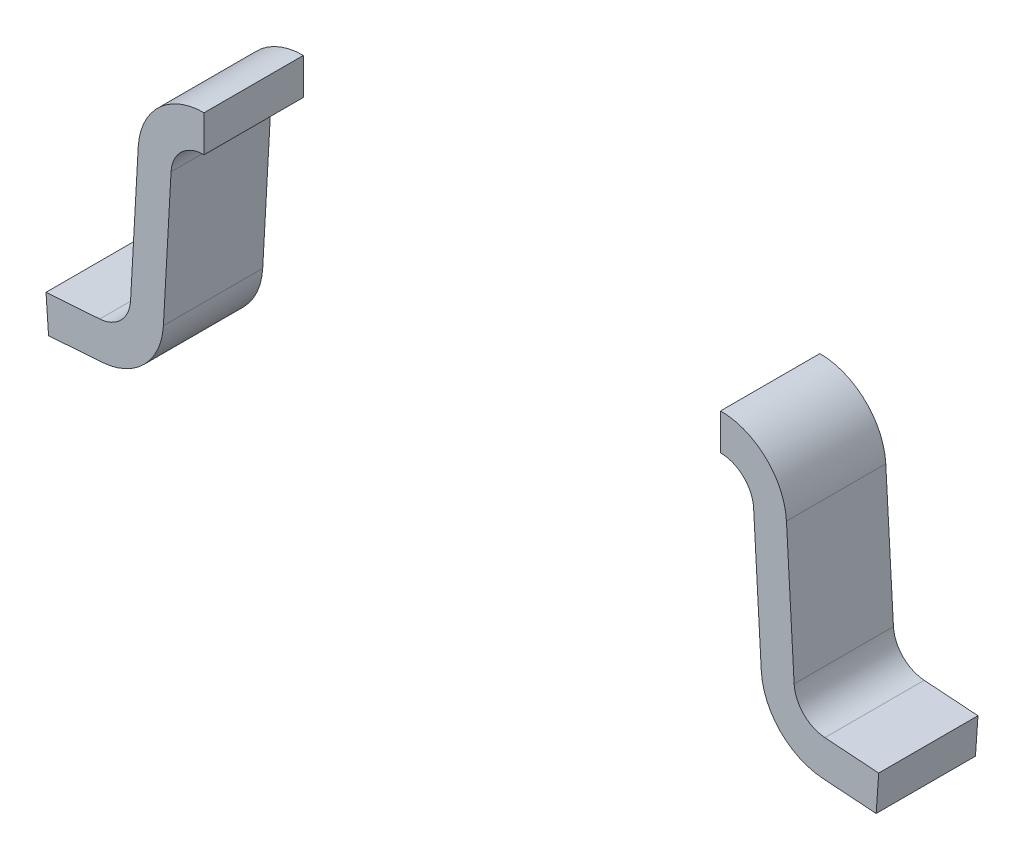
ISO-10303-21;
HEADER;
FILE_DESCRIPTION(('STEP AP214'),'2;1');
FILE_NAME('part.step','',(''),(''),'','','');
FILE_SCHEMA(('AUTOMOTIVE_DESIGN { 1 0 10303 214 1 1 1 1 }'));
ENDSEC;
DATA;
#1=APPLICATION_CONTEXT('core data for automotive mechanical design processes');
#2=APPLICATION_PROTOCOL_DEFINITION('international standard','automotive_design',2000,#1);
#3=PRODUCT_CONTEXT('',#1,'mechanical');
#4=PRODUCT('Part','Part','',(#3));
#5=PRODUCT_RELATED_PRODUCT_CATEGORY('part','',(#4));
#6=PRODUCT_DEFINITION_FORMATION('','',#4);
#7=PRODUCT_DEFINITION_CONTEXT('part definition',#1,'design');
#8=PRODUCT_DEFINITION('design','',#6,#7);
#9=PRODUCT_DEFINITION_SHAPE('','',#8);
#10=(LENGTH_UNIT() NAMED_UNIT(*) SI_UNIT(.MILLI.,.METRE.));
#11=(NAMED_UNIT(*) PLANE_ANGLE_UNIT() SI_UNIT($,.RADIAN.));
#12=(NAMED_UNIT(*) SI_UNIT($,.STERADIAN.) SOLID_ANGLE_UNIT());
#13=UNCERTAINTY_MEASURE_WITH_UNIT(LENGTH_MEASURE(1.E-05),#10,'distance_accuracy_value','');
#14=(GEOMETRIC_REPRESENTATION_CONTEXT(3) GLOBAL_UNCERTAINTY_ASSIGNED_CONTEXT((#13)) GLOBAL_UNIT_ASSIGNED_CONTEXT((#10,
#11,#12)) REPRESENTATION_CONTEXT('',''));
#15=CARTESIAN_POINT('',(0.,0.,0.));
#16=DIRECTION('',(0.,0.,1.));
#17=DIRECTION('',(1.,0.,0.));
#18=AXIS2_PLACEMENT_3D('',#15,#16,#17);
#19=CARTESIAN_POINT('',(1.007174787015,0.127248601792,0.));
#20=DIRECTION('',(0.0697564737441177,0.997564050259825,0.));
#21=DIRECTION('',(0.,0.,-1.));
#22=AXIS2_PLACEMENT_3D('',#19,#20,#21);
#23=PLANE('',#22);
#24=DIRECTION('',(0.,0.,-1.));
#25=VECTOR('',#24,1.);
#26=CARTESIAN_POINT('',(1.095116441979,0.121099122224,0.));
#27=LINE('',#26,#25);
#28=CARTESIAN_POINT('',(1.095116441979,0.121099122224,0.15));
#29=VERTEX_POINT('',#28);
#30=CARTESIAN_POINT('',(1.095116441979,0.121099122224,-0.15));
#31=VERTEX_POINT('',#30);
#32=EDGE_CURVE('P0_E174',#29,#31,#27,.T.);
#33=ORIENTED_EDGE('',*,*,#32,.F.);
#34=DIRECTION('',(-0.997564050259825,0.0697564737441177,0.));
#35=VECTOR('',#34,1.);
#36=CARTESIAN_POINT('',(1.257673212112,0.109732045529,0.15));
#37=LINE('',#36,#35);
#38=CARTESIAN_POINT('',(1.257673212112,0.109732045529,0.15));
#39=VERTEX_POINT('',#38);
#40=EDGE_CURVE('P0_E129',#39,#29,#37,.T.);
#41=ORIENTED_EDGE('',*,*,#40,.F.);
#42=DIRECTION('',(0.,0.,1.));
#43=VECTOR('',#42,1.);
#44=CARTESIAN_POINT('',(1.257673212112,0.109732045529,0.));
#45=LINE('',#44,#43);
#46=CARTESIAN_POINT('',(1.257673212112,0.109732045529,-0.15));
#47=VERTEX_POINT('',#46);
#48=EDGE_CURVE('P0_E11',#47,#39,#45,.T.);
#49=ORIENTED_EDGE('',*,*,#48,.F.);
#50=DIRECTION('',(0.997564050259825,-0.0697564737441177,0.));
#51=VECTOR('',#50,1.);
#52=CARTESIAN_POINT('',(1.257673212112,0.109732045529,-0.15));
#53=LINE('',#52,#51);
#54=EDGE_CURVE('P0_E127',#31,#47,#53,.T.);
#55=ORIENTED_EDGE('',*,*,#54,.F.);
#56=EDGE_LOOP('',(#33,#41,#49,#55));
#57=FACE_BOUND('',#56,.T.);
#58=ADVANCED_FACE('P0_F16',(#57),#23,.T.);
#59=CARTESIAN_POINT('',(1.25,0.,0.));
#60=DIRECTION('',(0.997564050259825,-0.0697564737441177,0.));
#61=DIRECTION('',(0.,0.,-1.));
#62=AXIS2_PLACEMENT_3D('',#59,#60,#61);
#63=PLANE('',#62);
#64=ORIENTED_EDGE('',*,*,#48,.T.);
#65=DIRECTION('',(0.0697564737441177,0.997564050259825,0.));
#66=VECTOR('',#65,1.);
#67=CARTESIAN_POINT('',(1.25,0.,0.15));
#68=LINE('',#67,#66);
#69=CARTESIAN_POINT('',(1.25,0.,0.15));
#70=VERTEX_POINT('',#69);
#71=EDGE_CURVE('P0_E153',#70,#39,#68,.T.);
#72=ORIENTED_EDGE('',*,*,#71,.F.);
#73=DIRECTION('',(0.,0.,-1.));
#74=VECTOR('',#73,1.);
#75=CARTESIAN_POINT('',(1.25,0.,0.));
#76=LINE('',#75,#74);
#77=CARTESIAN_POINT('',(1.25,0.,-0.15));
#78=VERTEX_POINT('',#77);
#79=EDGE_CURVE('P0_E27',#70,#78,#76,.T.);
#80=ORIENTED_EDGE('',*,*,#79,.T.);
#81=DIRECTION('',(-0.0697564737441177,-0.997564050259825,0.));
#82=VECTOR('',#81,1.);
#83=CARTESIAN_POINT('',(1.25,0.,-0.15));
#84=LINE('',#83,#82);
#85=EDGE_CURVE('P0_E132',#47,#78,#84,.T.);
#86=ORIENTED_EDGE('',*,*,#85,.F.);
#87=EDGE_LOOP('',(#64,#72,#80,#86));
#88=FACE_BOUND('',#87,.T.);
#89=ADVANCED_FACE('P0_F133',(#88),#63,.T.);
#90=CARTESIAN_POINT('',(0.912917070374,0.02357113462935,0.));
#91=DIRECTION('',(-0.0697564737441177,-0.997564050259825,0.));
#92=DIRECTION('',(-0.997564050259825,0.0697564737441177,0.));
#93=AXIS2_PLACEMENT_3D('',#90,#91,#92);
#94=PLANE('',#93);
#95=DIRECTION('',(0.,0.,1.));
#96=VECTOR('',#95,1.);
#97=CARTESIAN_POINT('',(1.088800380302,0.01127217549198,0.));
#98=LINE('',#97,#96);
#99=CARTESIAN_POINT('',(1.088800380302,0.01127217549198,-0.15));
#100=VERTEX_POINT('',#99);
#101=CARTESIAN_POINT('',(1.088800380302,0.01127217549198,0.15));
#102=VERTEX_POINT('',#101);
#103=EDGE_CURVE('P0_E206',#100,#102,#98,.T.);
#104=ORIENTED_EDGE('',*,*,#103,.F.);
#105=DIRECTION('',(-0.997564050259825,0.0697564737441177,0.));
#106=VECTOR('',#105,1.);
#107=CARTESIAN_POINT('',(0.912917070374,0.02357113462935,-0.15));
#108=LINE('',#107,#106);
#109=EDGE_CURVE('P0_E137',#78,#100,#108,.T.);
#110=ORIENTED_EDGE('',*,*,#109,.F.);
#111=ORIENTED_EDGE('',*,*,#79,.F.);
#112=DIRECTION('',(0.997564050259825,-0.0697564737441177,0.));
#113=VECTOR('',#112,1.);
#114=CARTESIAN_POINT('',(0.912917070374,0.02357113462935,0.15));
#115=LINE('',#114,#113);
#116=EDGE_CURVE('P0_E205',#102,#70,#115,.T.);
#117=ORIENTED_EDGE('',*,*,#116,.F.);
#118=EDGE_LOOP('',(#104,#110,#111,#117));
#119=FACE_BOUND('',#118,.T.);
#120=ADVANCED_FACE('P0_F380',(#119),#94,.T.);
#121=CARTESIAN_POINT('',(1.102751675051,0.210784985544,0.));
#122=DIRECTION('',(0.,0.,-1.));
#123=DIRECTION('',(-0.712004474939124,-0.702174926686123,0.));
#124=AXIS2_PLACEMENT_3D('',#121,#122,#123);
#125=CYLINDRICAL_SURFACE('',#124,0.2);
#126=CARTESIAN_POINT('',(1.102751675051,0.210784985544,-0.15));
#127=DIRECTION('',(0.,0.,1.));
#128=DIRECTION('',(-0.712004474939124,-0.702174926686123,0.));
#129=AXIS2_PLACEMENT_3D('',#126,#127,#128);
#130=CIRCLE('',#129,0.2);
#131=CARTESIAN_POINT('',(0.903064208544,0.1996084154,-0.15));
#132=VERTEX_POINT('',#131);
#133=EDGE_CURVE('P0_E161',#132,#100,#130,.T.);
#134=ORIENTED_EDGE('',*,*,#133,.T.);
#135=ORIENTED_EDGE('',*,*,#103,.T.);
#136=CARTESIAN_POINT('',(1.102751675051,0.210784985544,0.15));
#137=DIRECTION('',(0.,0.,-1.));
#138=DIRECTION('',(-0.712004474939124,-0.702174926686123,0.));
#139=AXIS2_PLACEMENT_3D('',#136,#137,#138);
#140=CIRCLE('',#139,0.2);
#141=CARTESIAN_POINT('',(0.903064208544,0.1996084154,0.15));
#142=VERTEX_POINT('',#141);
#143=EDGE_CURVE('P0_E157',#102,#142,#140,.T.);
#144=ORIENTED_EDGE('',*,*,#143,.T.);
#145=DIRECTION('',(0.,0.,-1.));
#146=VECTOR('',#145,1.);
#147=CARTESIAN_POINT('',(0.903064208544,0.1996084154,0.));
#148=LINE('',#147,#146);
#149=EDGE_CURVE('P0_E179',#142,#132,#148,.T.);
#150=ORIENTED_EDGE('',*,*,#149,.T.);
#151=EDGE_LOOP('',(#134,#135,#144,#150));
#152=FACE_BOUND('',#151,.T.);
#153=ADVANCED_FACE('P0_F18',(#152),#125,.T.);
#154=CARTESIAN_POINT('',(0.936359992504,0.748533228309,0.15));
#155=DIRECTION('',(0.,0.,1.));
#156=DIRECTION('',(1.,0.,0.));
#157=AXIS2_PLACEMENT_3D('',#154,#155,#156);
#158=PLANE('',#157);
#159=DIRECTION('',(0.,-1.,0.));
#160=VECTOR('',#159,1.);
#161=CARTESIAN_POINT('',(0.780030212559,0.267222131695,0.15));
#162=LINE('',#161,#160);
#163=CARTESIAN_POINT('',(0.780030212559,0.818350532402,0.15));
#164=VERTEX_POINT('',#163);
#165=CARTESIAN_POINT('',(0.780030212559,0.708351607056,0.15));
#166=VERTEX_POINT('',#165);
#167=EDGE_CURVE('P0_E185',#164,#166,#162,.T.);
#168=ORIENTED_EDGE('',*,*,#167,.T.);
#169=CARTESIAN_POINT('',(0.780030212559,0.608351607056,0.15));
#170=DIRECTION('',(0.,0.,1.));
#171=DIRECTION('',(0.687065189512227,0.72659577851824,0.));
#172=AXIS2_PLACEMENT_3D('',#169,#170,#171);
#173=CIRCLE('',#172,0.1);
#174=CARTESIAN_POINT('',(0.879873945812,0.613939892128,0.15));
#175=VERTEX_POINT('',#174);
#176=EDGE_CURVE('P0_E176',#175,#166,#173,.T.);
#177=ORIENTED_EDGE('',*,*,#176,.F.);
#178=DIRECTION('',(0.0558828507205525,-0.998437332532866,0.));
#179=VECTOR('',#178,1.);
#180=CARTESIAN_POINT('',(0.87458969251,0.708351607056,0.15));
#181=LINE('',#180,#179);
#182=EDGE_CURVE('P0_E158',#175,#142,#181,.T.);
#183=ORIENTED_EDGE('',*,*,#182,.T.);
#184=ORIENTED_EDGE('',*,*,#143,.F.);
#185=ORIENTED_EDGE('',*,*,#116,.T.);
#186=ORIENTED_EDGE('',*,*,#71,.T.);
#187=ORIENTED_EDGE('',*,*,#40,.T.);
#188=CARTESIAN_POINT('',(1.102092089354,0.22085552725,0.15));
#189=DIRECTION('',(0.,0.,1.));
#190=DIRECTION('',(-0.712004474939124,-0.702174926686123,0.));
#191=AXIS2_PLACEMENT_3D('',#188,#189,#190);
#192=CIRCLE('',#191,0.1);
#193=CARTESIAN_POINT('',(1.002248356101,0.215267242178,0.15));
#194=VERTEX_POINT('',#193);
#195=EDGE_CURVE('P0_E170',#194,#29,#192,.T.);
#196=ORIENTED_EDGE('',*,*,#195,.F.);
#197=DIRECTION('',(-0.0558828507205525,0.998437332532866,0.));
#198=VECTOR('',#197,1.);
#199=CARTESIAN_POINT('',(1.007174787015,0.127248601792,0.15));
#200=LINE('',#199,#198);
#201=CARTESIAN_POINT('',(0.97906204161,0.6295281772,0.15));
#202=VERTEX_POINT('',#201);
#203=EDGE_CURVE('P0_E190',#194,#202,#200,.T.);
#204=ORIENTED_EDGE('',*,*,#203,.T.);
#205=CARTESIAN_POINT('',(0.779374575103,0.618351607056,0.15));
#206=DIRECTION('',(0.,0.,-1.));
#207=DIRECTION('',(0.687065189512227,0.72659577851824,0.));
#208=AXIS2_PLACEMENT_3D('',#205,#206,#207);
#209=CIRCLE('',#208,0.2);
#210=EDGE_CURVE('P0_E80',#164,#202,#209,.T.);
#211=ORIENTED_EDGE('',*,*,#210,.F.);
#212=EDGE_LOOP('',(#168,#177,#183,#184,#185,#186,#187,#196,#204,#211));
#213=FACE_BOUND('',#212,.T.);
#214=ADVANCED_FACE('P0_F237',(#213),#158,.T.);
#215=CARTESIAN_POINT('',(0.779374575103,0.618351607056,0.));
#216=DIRECTION('',(0.,0.,-1.));
#217=DIRECTION('',(0.687065189512227,0.72659577851824,0.));
#218=AXIS2_PLACEMENT_3D('',#215,#216,#217);
#219=CYLINDRICAL_SURFACE('',#218,0.2);
#220=DIRECTION('',(0.,0.,1.));
#221=VECTOR('',#220,1.);
#222=CARTESIAN_POINT('',(0.780030212559,0.818350532402,0.));
#223=LINE('',#222,#221);
#224=CARTESIAN_POINT('',(0.780030212559,0.818350532402,-0.15));
#225=VERTEX_POINT('',#224);
#226=EDGE_CURVE('P0_E199',#225,#164,#223,.T.);
#227=ORIENTED_EDGE('',*,*,#226,.T.);
#228=ORIENTED_EDGE('',*,*,#210,.T.);
#229=DIRECTION('',(0.,0.,-1.));
#230=VECTOR('',#229,1.);
#231=CARTESIAN_POINT('',(0.97906204161,0.6295281772,0.));
#232=LINE('',#231,#230);
#233=CARTESIAN_POINT('',(0.97906204161,0.6295281772,-0.15));
#234=VERTEX_POINT('',#233);
#235=EDGE_CURVE('P0_E188',#202,#234,#232,.T.);
#236=ORIENTED_EDGE('',*,*,#235,.T.);
#237=CARTESIAN_POINT('',(0.779374575103,0.618351607056,-0.15));
#238=DIRECTION('',(0.,0.,1.));
#239=DIRECTION('',(0.687065189512227,0.72659577851824,0.));
#240=AXIS2_PLACEMENT_3D('',#237,#238,#239);
#241=CIRCLE('',#240,0.2);
#242=EDGE_CURVE('P0_E95',#234,#225,#241,.T.);
#243=ORIENTED_EDGE('',*,*,#242,.T.);
#244=EDGE_LOOP('',(#227,#228,#236,#243));
#245=FACE_BOUND('',#244,.T.);
#246=ADVANCED_FACE('P0_F342',(#245),#219,.T.);
#247=CARTESIAN_POINT('',(0.87458969251,0.708351607056,0.));
#248=DIRECTION('',(-0.998437332532866,-0.0558828507205525,0.));
#249=DIRECTION('',(-0.0558828507205525,0.998437332532866,0.));
#250=AXIS2_PLACEMENT_3D('',#247,#248,#249);
#251=PLANE('',#250);
#252=DIRECTION('',(0.,0.,1.));
#253=VECTOR('',#252,1.);
#254=CARTESIAN_POINT('',(0.879873945812,0.613939892128,0.));
#255=LINE('',#254,#253);
#256=CARTESIAN_POINT('',(0.879873945812,0.613939892128,-0.15));
#257=VERTEX_POINT('',#256);
#258=EDGE_CURVE('P0_E180',#257,#175,#255,.T.);
#259=ORIENTED_EDGE('',*,*,#258,.F.);
#260=DIRECTION('',(-0.0558828507205525,0.998437332532866,0.));
#261=VECTOR('',#260,1.);
#262=CARTESIAN_POINT('',(0.87458969251,0.708351607056,-0.15));
#263=LINE('',#262,#261);
#264=EDGE_CURVE('P0_E162',#132,#257,#263,.T.);
#265=ORIENTED_EDGE('',*,*,#264,.F.);
#266=ORIENTED_EDGE('',*,*,#149,.F.);
#267=ORIENTED_EDGE('',*,*,#182,.F.);
#268=EDGE_LOOP('',(#259,#265,#266,#267));
#269=FACE_BOUND('',#268,.T.);
#270=ADVANCED_FACE('P0_F337',(#269),#251,.T.);
#271=CARTESIAN_POINT('',(0.780030212559,0.608351607056,0.));
#272=DIRECTION('',(0.,0.,1.));
#273=DIRECTION('',(0.687065189512227,0.72659577851824,0.));
#274=AXIS2_PLACEMENT_3D('',#271,#272,#273);
#275=CYLINDRICAL_SURFACE('',#274,0.1);
#276=CARTESIAN_POINT('',(0.780030212559,0.608351607056,-0.15));
#277=DIRECTION('',(0.,0.,-1.));
#278=DIRECTION('',(0.687065189512227,0.72659577851824,0.));
#279=AXIS2_PLACEMENT_3D('',#276,#277,#278);
#280=CIRCLE('',#279,0.1);
#281=CARTESIAN_POINT('',(0.780030212559,0.708351607056,-0.15));
#282=VERTEX_POINT('',#281);
#283=EDGE_CURVE('P0_E166',#282,#257,#280,.T.);
#284=ORIENTED_EDGE('',*,*,#283,.T.);
#285=ORIENTED_EDGE('',*,*,#258,.T.);
#286=ORIENTED_EDGE('',*,*,#176,.T.);
#287=DIRECTION('',(0.,0.,-1.));
#288=VECTOR('',#287,1.);
#289=CARTESIAN_POINT('',(0.780030212559,0.708351607056,0.));
#290=LINE('',#289,#288);
#291=EDGE_CURVE('P0_E181',#166,#282,#290,.T.);
#292=ORIENTED_EDGE('',*,*,#291,.T.);
#293=EDGE_LOOP('',(#284,#285,#286,#292));
#294=FACE_BOUND('',#293,.T.);
#295=ADVANCED_FACE('P0_F324',(#294),#275,.F.);
#296=CARTESIAN_POINT('',(1.007174787015,0.127248601792,0.));
#297=DIRECTION('',(0.998437332532866,0.0558828507205525,0.));
#298=DIRECTION('',(0.,0.,-1.));
#299=AXIS2_PLACEMENT_3D('',#296,#297,#298);
#300=PLANE('',#299);
#301=DIRECTION('',(0.,0.,1.));
#302=VECTOR('',#301,1.);
#303=CARTESIAN_POINT('',(1.002248356101,0.215267242178,0.));
#304=LINE('',#303,#302);
#305=CARTESIAN_POINT('',(1.002248356101,0.215267242178,-0.15));
#306=VERTEX_POINT('',#305);
#307=EDGE_CURVE('P0_E175',#306,#194,#304,.T.);
#308=ORIENTED_EDGE('',*,*,#307,.F.);
#309=DIRECTION('',(0.0558828507205525,-0.998437332532866,0.));
#310=VECTOR('',#309,1.);
#311=CARTESIAN_POINT('',(1.007174787015,0.127248601792,-0.15));
#312=LINE('',#311,#310);
#313=EDGE_CURVE('P0_E149',#234,#306,#312,.T.);
#314=ORIENTED_EDGE('',*,*,#313,.F.);
#315=ORIENTED_EDGE('',*,*,#235,.F.);
#316=ORIENTED_EDGE('',*,*,#203,.F.);
#317=EDGE_LOOP('',(#308,#314,#315,#316));
#318=FACE_BOUND('',#317,.T.);
#319=ADVANCED_FACE('P0_F235',(#318),#300,.T.);
#320=CARTESIAN_POINT('',(1.102092089354,0.22085552725,0.));
#321=DIRECTION('',(0.,0.,1.));
#322=DIRECTION('',(-0.712004474939124,-0.702174926686123,0.));
#323=AXIS2_PLACEMENT_3D('',#320,#321,#322);
#324=CYLINDRICAL_SURFACE('',#323,0.1);
#325=CARTESIAN_POINT('',(1.102092089354,0.22085552725,-0.15));
#326=DIRECTION('',(0.,0.,-1.));
#327=DIRECTION('',(-0.712004474939124,-0.702174926686123,0.));
#328=AXIS2_PLACEMENT_3D('',#325,#326,#327);
#329=CIRCLE('',#328,0.1);
#330=EDGE_CURVE('P0_E142',#31,#306,#329,.T.);
#331=ORIENTED_EDGE('',*,*,#330,.T.);
#332=ORIENTED_EDGE('',*,*,#307,.T.);
#333=ORIENTED_EDGE('',*,*,#195,.T.);
#334=ORIENTED_EDGE('',*,*,#32,.T.);
#335=EDGE_LOOP('',(#331,#332,#333,#334));
#336=FACE_BOUND('',#335,.T.);
#337=ADVANCED_FACE('P0_F231',(#336),#324,.F.);
#338=CARTESIAN_POINT('',(0.936359992504,0.748533228309,-0.15));
#339=DIRECTION('',(0.,0.,-1.));
#340=DIRECTION('',(0.,-1.,0.));
#341=AXIS2_PLACEMENT_3D('',#338,#339,#340);
#342=PLANE('',#341);
#343=DIRECTION('',(0.,1.,0.));
#344=VECTOR('',#343,1.);
#345=CARTESIAN_POINT('',(0.780030212559,0.267222131695,-0.15));
#346=LINE('',#345,#344);
#347=EDGE_CURVE('P0_E20',#282,#225,#346,.T.);
#348=ORIENTED_EDGE('',*,*,#347,.T.);
#349=ORIENTED_EDGE('',*,*,#242,.F.);
#350=ORIENTED_EDGE('',*,*,#313,.T.);
#351=ORIENTED_EDGE('',*,*,#330,.F.);
#352=ORIENTED_EDGE('',*,*,#54,.T.);
#353=ORIENTED_EDGE('',*,*,#85,.T.);
#354=ORIENTED_EDGE('',*,*,#109,.T.);
#355=ORIENTED_EDGE('',*,*,#133,.F.);
#356=ORIENTED_EDGE('',*,*,#264,.T.);
#357=ORIENTED_EDGE('',*,*,#283,.F.);
#358=EDGE_LOOP('',(#348,#349,#350,#351,#352,#353,#354,#355,#356,#357));
#359=FACE_BOUND('',#358,.T.);
#360=ADVANCED_FACE('P0_F139',(#359),#342,.T.);
#361=CARTESIAN_POINT('',(0.780030212559,-0.214088964919,0.15));
#362=DIRECTION('',(1.,0.,0.));
#363=DIRECTION('',(0.,1.,0.));
#364=AXIS2_PLACEMENT_3D('',#361,#362,#363);
#365=PLANE('',#364);
#366=ORIENTED_EDGE('',*,*,#226,.F.);
#367=ORIENTED_EDGE('',*,*,#347,.F.);
#368=ORIENTED_EDGE('',*,*,#291,.F.);
#369=ORIENTED_EDGE('',*,*,#167,.F.);
#370=EDGE_LOOP('',(#366,#367,#368,#369));
#371=FACE_BOUND('',#370,.T.);
#372=ADVANCED_FACE('P0_F372',(#371),#365,.F.);
#373=CLOSED_SHELL('',(#58,#89,#120,#153,#214,#246,#270,#295,#319,#337,#360,#372));
#374=MANIFOLD_SOLID_BREP('P0_B1',#373);
#375=CARTESIAN_POINT('',(-0.780030212559,1.630792179031,0.15));
#376=DIRECTION('',(-1.,0.,0.));
#377=DIRECTION('',(0.,0.,1.));
#378=AXIS2_PLACEMENT_3D('',#375,#376,#377);
#379=PLANE('',#378);
#380=DIRECTION('',(0.,0.,-1.));
#381=VECTOR('',#380,1.);
#382=CARTESIAN_POINT('',(-0.780030212559,0.818350532402,0.));
#383=LINE('',#382,#381);
#384=CARTESIAN_POINT('',(-0.780030212559,0.818350532402,0.15));
#385=VERTEX_POINT('',#384);
#386=CARTESIAN_POINT('',(-0.780030212559,0.818350532402,-0.15));
#387=VERTEX_POINT('',#386);
#388=EDGE_CURVE('P1_E212',#385,#387,#383,.T.);
#389=ORIENTED_EDGE('',*,*,#388,.F.);
#390=DIRECTION('',(0.,1.,0.));
#391=VECTOR('',#390,1.);
#392=CARTESIAN_POINT('',(-0.780030212559,1.18966270367,0.15));
#393=LINE('',#392,#391);
#394=CARTESIAN_POINT('',(-0.780030212559,0.708351607056,0.15));
#395=VERTEX_POINT('',#394);
#396=EDGE_CURVE('P1_E25',#395,#385,#393,.T.);
#397=ORIENTED_EDGE('',*,*,#396,.F.);
#398=DIRECTION('',(0.,0.,-1.));
#399=VECTOR('',#398,1.);
#400=CARTESIAN_POINT('',(-0.780030212559,0.708351607056,0.));
#401=LINE('',#400,#399);
#402=CARTESIAN_POINT('',(-0.780030212559,0.708351607056,-0.15));
#403=VERTEX_POINT('',#402);
#404=EDGE_CURVE('P1_E182',#395,#403,#401,.T.);
#405=ORIENTED_EDGE('',*,*,#404,.T.);
#406=DIRECTION('',(0.,-1.,0.));
#407=VECTOR('',#406,1.);
#408=CARTESIAN_POINT('',(-0.780030212559,1.18966270367,-0.15));
#409=LINE('',#408,#407);
#410=EDGE_CURVE('P1_E11',#387,#403,#409,.T.);
#411=ORIENTED_EDGE('',*,*,#410,.F.);
#412=EDGE_LOOP('',(#389,#397,#405,#411));
#413=FACE_BOUND('',#412,.T.);
#414=ADVANCED_FACE('P1_F16',(#413),#379,.F.);
#415=CARTESIAN_POINT('',(0.936359992504,0.748533228309,-0.15));
#416=DIRECTION('',(0.,0.,-1.));
#417=DIRECTION('',(0.,-1.,0.));
#418=AXIS2_PLACEMENT_3D('',#415,#416,#417);
#419=PLANE('',#418);
#420=ORIENTED_EDGE('',*,*,#410,.T.);
#421=CARTESIAN_POINT('',(-0.780030212559,0.608351607056,-0.15));
#422=DIRECTION('',(0.,0.,1.));
#423=DIRECTION('',(-0.687065189512227,0.72659577851824,0.));
#424=AXIS2_PLACEMENT_3D('',#421,#422,#423);
#425=CIRCLE('',#424,0.1);
#426=CARTESIAN_POINT('',(-0.879873945812,0.613939892128,-0.15));
#427=VERTEX_POINT('',#426);
#428=EDGE_CURVE('P1_E132',#403,#427,#425,.T.);
#429=ORIENTED_EDGE('',*,*,#428,.T.);
#430=DIRECTION('',(0.0558828507205525,0.998437332532866,0.));
#431=VECTOR('',#430,1.);
#432=CARTESIAN_POINT('',(-0.87458969251,0.708351607056,-0.15));
#433=LINE('',#432,#431);
#434=CARTESIAN_POINT('',(-0.903064208544,0.1996084154,-0.15));
#435=VERTEX_POINT('',#434);
#436=EDGE_CURVE('P1_E128',#435,#427,#433,.T.);
#437=ORIENTED_EDGE('',*,*,#436,.F.);
#438=CARTESIAN_POINT('',(-1.102751675051,0.210784985544,-0.15));
#439=DIRECTION('',(0.,0.,-1.));
#440=DIRECTION('',(0.712004474939124,-0.702174926686123,0.));
#441=AXIS2_PLACEMENT_3D('',#438,#439,#440);
#442=CIRCLE('',#441,0.2);
#443=CARTESIAN_POINT('',(-1.088800380302,0.01127217549198,-0.15));
#444=VERTEX_POINT('',#443);
#445=EDGE_CURVE('P1_E123',#435,#444,#442,.T.);
#446=ORIENTED_EDGE('',*,*,#445,.T.);
#447=DIRECTION('',(0.997564050259825,0.0697564737441177,0.));
#448=VECTOR('',#447,1.);
#449=CARTESIAN_POINT('',(-0.912917070374,0.02357113462935,-0.15));
#450=LINE('',#449,#448);
#451=CARTESIAN_POINT('',(-1.25,0.,-0.15));
#452=VERTEX_POINT('',#451);
#453=EDGE_CURVE('P1_E152',#452,#444,#450,.T.);
#454=ORIENTED_EDGE('',*,*,#453,.F.);
#455=DIRECTION('',(0.0697564737441177,-0.997564050259825,0.));
#456=VECTOR('',#455,1.);
#457=CARTESIAN_POINT('',(-1.25,0.,-0.15));
#458=LINE('',#457,#456);
#459=CARTESIAN_POINT('',(-1.257673212112,0.109732045529,-0.15));
#460=VERTEX_POINT('',#459);
#461=EDGE_CURVE('P1_E195',#460,#452,#458,.T.);
#462=ORIENTED_EDGE('',*,*,#461,.F.);
#463=DIRECTION('',(-0.997564050259825,-0.0697564737441177,0.));
#464=VECTOR('',#463,1.);
#465=CARTESIAN_POINT('',(-1.257673212112,0.109732045529,-0.15));
#466=LINE('',#465,#464);
#467=CARTESIAN_POINT('',(-1.095116441979,0.121099122224,-0.15));
#468=VERTEX_POINT('',#467);
#469=EDGE_CURVE('P1_E234',#468,#460,#466,.T.);
#470=ORIENTED_EDGE('',*,*,#469,.F.);
#471=CARTESIAN_POINT('',(-1.102092089354,0.22085552725,-0.15));
#472=DIRECTION('',(0.,0.,1.));
#473=DIRECTION('',(0.712004474939124,-0.702174926686123,0.));
#474=AXIS2_PLACEMENT_3D('',#471,#472,#473);
#475=CIRCLE('',#474,0.1);
#476=CARTESIAN_POINT('',(-1.002248356101,0.215267242178,-0.15));
#477=VERTEX_POINT('',#476);
#478=EDGE_CURVE('P1_E51',#468,#477,#475,.T.);
#479=ORIENTED_EDGE('',*,*,#478,.T.);
#480=DIRECTION('',(-0.0558828507205525,-0.998437332532866,0.));
#481=VECTOR('',#480,1.);
#482=CARTESIAN_POINT('',(-1.007174787015,0.127248601792,-0.15));
#483=LINE('',#482,#481);
#484=CARTESIAN_POINT('',(-0.97906204161,0.6295281772,-0.15));
#485=VERTEX_POINT('',#484);
#486=EDGE_CURVE('P1_E179',#485,#477,#483,.T.);
#487=ORIENTED_EDGE('',*,*,#486,.F.);
#488=CARTESIAN_POINT('',(-0.779374575103,0.618351607056,-0.15));
#489=DIRECTION('',(0.,0.,-1.));
#490=DIRECTION('',(-0.687065189512227,0.72659577851824,0.));
#491=AXIS2_PLACEMENT_3D('',#488,#489,#490);
#492=CIRCLE('',#491,0.2);
#493=EDGE_CURVE('P1_E206',#485,#387,#492,.T.);
#494=ORIENTED_EDGE('',*,*,#493,.T.);
#495=EDGE_LOOP('',(#420,#429,#437,#446,#454,#462,#470,#479,#487,#494));
#496=FACE_BOUND('',#495,.T.);
#497=ADVANCED_FACE('P1_F130',(#496),#419,.T.);
#498=CARTESIAN_POINT('',(0.936359992504,0.748533228309,0.15));
#499=DIRECTION('',(0.,0.,1.));
#500=DIRECTION('',(1.,0.,0.));
#501=AXIS2_PLACEMENT_3D('',#498,#499,#500);
#502=PLANE('',#501);
#503=ORIENTED_EDGE('',*,*,#396,.T.);
#504=CARTESIAN_POINT('',(-0.779374575103,0.618351607056,0.15));
#505=DIRECTION('',(0.,0.,1.));
#506=DIRECTION('',(-0.687065189512227,0.72659577851824,0.));
#507=AXIS2_PLACEMENT_3D('',#504,#505,#506);
#508=CIRCLE('',#507,0.2);
#509=CARTESIAN_POINT('',(-0.97906204161,0.6295281772,0.15));
#510=VERTEX_POINT('',#509);
#511=EDGE_CURVE('P1_E162',#385,#510,#508,.T.);
#512=ORIENTED_EDGE('',*,*,#511,.T.);
#513=DIRECTION('',(0.0558828507205525,0.998437332532866,0.));
#514=VECTOR('',#513,1.);
#515=CARTESIAN_POINT('',(-1.007174787015,0.127248601792,0.15));
#516=LINE('',#515,#514);
#517=CARTESIAN_POINT('',(-1.002248356101,0.215267242178,0.15));
#518=VERTEX_POINT('',#517);
#519=EDGE_CURVE('P1_E172',#518,#510,#516,.T.);
#520=ORIENTED_EDGE('',*,*,#519,.F.);
#521=CARTESIAN_POINT('',(-1.102092089354,0.22085552725,0.15));
#522=DIRECTION('',(0.,0.,-1.));
#523=DIRECTION('',(0.712004474939124,-0.702174926686123,0.));
#524=AXIS2_PLACEMENT_3D('',#521,#522,#523);
#525=CIRCLE('',#524,0.1);
#526=CARTESIAN_POINT('',(-1.095116441979,0.121099122224,0.15));
#527=VERTEX_POINT('',#526);
#528=EDGE_CURVE('P1_E38',#518,#527,#525,.T.);
#529=ORIENTED_EDGE('',*,*,#528,.T.);
#530=DIRECTION('',(0.997564050259825,0.0697564737441177,0.));
#531=VECTOR('',#530,1.);
#532=CARTESIAN_POINT('',(-1.257673212112,0.109732045529,0.15));
#533=LINE('',#532,#531);
#534=CARTESIAN_POINT('',(-1.257673212112,0.109732045529,0.15));
#535=VERTEX_POINT('',#534);
#536=EDGE_CURVE('P1_E200',#535,#527,#533,.T.);
#537=ORIENTED_EDGE('',*,*,#536,.F.);
#538=DIRECTION('',(-0.0697564737441177,0.997564050259825,0.));
#539=VECTOR('',#538,1.);
#540=CARTESIAN_POINT('',(-1.25,0.,0.15));
#541=LINE('',#540,#539);
#542=CARTESIAN_POINT('',(-1.25,0.,0.15));
#543=VERTEX_POINT('',#542);
#544=EDGE_CURVE('P1_E211',#543,#535,#541,.T.);
#545=ORIENTED_EDGE('',*,*,#544,.F.);
#546=DIRECTION('',(-0.997564050259825,-0.0697564737441177,0.));
#547=VECTOR('',#546,1.);
#548=CARTESIAN_POINT('',(-0.912917070374,0.02357113462935,0.15));
#549=LINE('',#548,#547);
#550=CARTESIAN_POINT('',(-1.088800380302,0.01127217549198,0.15));
#551=VERTEX_POINT('',#550);
#552=EDGE_CURVE('P1_E113',#551,#543,#549,.T.);
#553=ORIENTED_EDGE('',*,*,#552,.F.);
#554=CARTESIAN_POINT('',(-1.102751675051,0.210784985544,0.15));
#555=DIRECTION('',(0.,0.,1.));
#556=DIRECTION('',(0.712004474939124,-0.702174926686123,0.));
#557=AXIS2_PLACEMENT_3D('',#554,#555,#556);
#558=CIRCLE('',#557,0.2);
#559=CARTESIAN_POINT('',(-0.903064208544,0.1996084154,0.15));
#560=VERTEX_POINT('',#559);
#561=EDGE_CURVE('P1_E146',#551,#560,#558,.T.);
#562=ORIENTED_EDGE('',*,*,#561,.T.);
#563=DIRECTION('',(-0.0558828507205525,-0.998437332532866,0.));
#564=VECTOR('',#563,1.);
#565=CARTESIAN_POINT('',(-0.87458969251,0.708351607056,0.15));
#566=LINE('',#565,#564);
#567=CARTESIAN_POINT('',(-0.879873945812,0.613939892128,0.15));
#568=VERTEX_POINT('',#567);
#569=EDGE_CURVE('P1_E137',#568,#560,#566,.T.);
#570=ORIENTED_EDGE('',*,*,#569,.F.);
#571=CARTESIAN_POINT('',(-0.780030212559,0.608351607056,0.15));
#572=DIRECTION('',(0.,0.,-1.));
#573=DIRECTION('',(-0.687065189512227,0.72659577851824,0.));
#574=AXIS2_PLACEMENT_3D('',#571,#572,#573);
#575=CIRCLE('',#574,0.1);
#576=EDGE_CURVE('P1_E173',#568,#395,#575,.T.);
#577=ORIENTED_EDGE('',*,*,#576,.T.);
#578=EDGE_LOOP('',(#503,#512,#520,#529,#537,#545,#553,#562,#570,#577));
#579=FACE_BOUND('',#578,.T.);
#580=ADVANCED_FACE('P1_F397',(#579),#502,.T.);
#581=CARTESIAN_POINT('',(-1.102092089354,0.22085552725,0.));
#582=DIRECTION('',(0.,0.,-1.));
#583=DIRECTION('',(0.712004474939124,-0.702174926686123,0.));
#584=AXIS2_PLACEMENT_3D('',#581,#582,#583);
#585=CYLINDRICAL_SURFACE('',#584,0.1);
#586=ORIENTED_EDGE('',*,*,#478,.F.);
#587=DIRECTION('',(0.,0.,-1.));
#588=VECTOR('',#587,1.);
#589=CARTESIAN_POINT('',(-1.095116441979,0.121099122224,0.));
#590=LINE('',#589,#588);
#591=EDGE_CURVE('P1_E160',#527,#468,#590,.T.);
#592=ORIENTED_EDGE('',*,*,#591,.F.);
#593=ORIENTED_EDGE('',*,*,#528,.F.);
#594=DIRECTION('',(0.,0.,1.));
#595=VECTOR('',#594,1.);
#596=CARTESIAN_POINT('',(-1.002248356101,0.215267242178,0.));
#597=LINE('',#596,#595);
#598=EDGE_CURVE('P1_E169',#477,#518,#597,.T.);
#599=ORIENTED_EDGE('',*,*,#598,.F.);
#600=EDGE_LOOP('',(#586,#592,#593,#599));
#601=FACE_BOUND('',#600,.T.);
#602=ADVANCED_FACE('P1_F231',(#601),#585,.F.);
#603=CARTESIAN_POINT('',(-1.007174787015,0.127248601792,0.));
#604=DIRECTION('',(0.998437332532866,-0.0558828507205525,0.));
#605=DIRECTION('',(0.,0.,-1.));
#606=AXIS2_PLACEMENT_3D('',#603,#604,#605);
#607=PLANE('',#606);
#608=ORIENTED_EDGE('',*,*,#598,.T.);
#609=ORIENTED_EDGE('',*,*,#519,.T.);
#610=DIRECTION('',(0.,0.,-1.));
#611=VECTOR('',#610,1.);
#612=CARTESIAN_POINT('',(-0.97906204161,0.6295281772,0.));
#613=LINE('',#612,#611);
#614=EDGE_CURVE('P1_E167',#510,#485,#613,.T.);
#615=ORIENTED_EDGE('',*,*,#614,.T.);
#616=ORIENTED_EDGE('',*,*,#486,.T.);
#617=EDGE_LOOP('',(#608,#609,#615,#616));
#618=FACE_BOUND('',#617,.T.);
#619=ADVANCED_FACE('P1_F228',(#618),#607,.F.);
#620=CARTESIAN_POINT('',(-0.780030212559,0.608351607056,0.));
#621=DIRECTION('',(0.,0.,-1.));
#622=DIRECTION('',(-0.687065189512227,0.72659577851824,0.));
#623=AXIS2_PLACEMENT_3D('',#620,#621,#622);
#624=CYLINDRICAL_SURFACE('',#623,0.1);
#625=ORIENTED_EDGE('',*,*,#428,.F.);
#626=ORIENTED_EDGE('',*,*,#404,.F.);
#627=ORIENTED_EDGE('',*,*,#576,.F.);
#628=DIRECTION('',(0.,0.,1.));
#629=VECTOR('',#628,1.);
#630=CARTESIAN_POINT('',(-0.879873945812,0.613939892128,0.));
#631=LINE('',#630,#629);
#632=EDGE_CURVE('P1_E166',#427,#568,#631,.T.);
#633=ORIENTED_EDGE('',*,*,#632,.F.);
#634=EDGE_LOOP('',(#625,#626,#627,#633));
#635=FACE_BOUND('',#634,.T.);
#636=ADVANCED_FACE('P1_F371',(#635),#624,.F.);
#637=CARTESIAN_POINT('',(-0.87458969251,0.708351607056,0.));
#638=DIRECTION('',(-0.998437332532866,0.0558828507205525,0.));
#639=DIRECTION('',(0.,0.,1.));
#640=AXIS2_PLACEMENT_3D('',#637,#638,#639);
#641=PLANE('',#640);
#642=ORIENTED_EDGE('',*,*,#632,.T.);
#643=ORIENTED_EDGE('',*,*,#569,.T.);
#644=DIRECTION('',(0.,0.,-1.));
#645=VECTOR('',#644,1.);
#646=CARTESIAN_POINT('',(-0.903064208544,0.1996084154,0.));
#647=LINE('',#646,#645);
#648=EDGE_CURVE('P1_E140',#560,#435,#647,.T.);
#649=ORIENTED_EDGE('',*,*,#648,.T.);
#650=ORIENTED_EDGE('',*,*,#436,.T.);
#651=EDGE_LOOP('',(#642,#643,#649,#650));
#652=FACE_BOUND('',#651,.T.);
#653=ADVANCED_FACE('P1_F141',(#652),#641,.F.);
#654=CARTESIAN_POINT('',(-0.779374575103,0.618351607056,0.));
#655=DIRECTION('',(0.,0.,1.));
#656=DIRECTION('',(-0.687065189512227,0.72659577851824,0.));
#657=AXIS2_PLACEMENT_3D('',#654,#655,#656);
#658=CYLINDRICAL_SURFACE('',#657,0.2);
#659=ORIENTED_EDGE('',*,*,#388,.T.);
#660=ORIENTED_EDGE('',*,*,#493,.F.);
#661=ORIENTED_EDGE('',*,*,#614,.F.);
#662=ORIENTED_EDGE('',*,*,#511,.F.);
#663=EDGE_LOOP('',(#659,#660,#661,#662));
#664=FACE_BOUND('',#663,.T.);
#665=ADVANCED_FACE('P1_F352',(#664),#658,.T.);
#666=CARTESIAN_POINT('',(-1.102751675051,0.210784985544,0.));
#667=DIRECTION('',(0.,0.,1.));
#668=DIRECTION('',(0.712004474939124,-0.702174926686123,0.));
#669=AXIS2_PLACEMENT_3D('',#666,#667,#668);
#670=CYLINDRICAL_SURFACE('',#669,0.2);
#671=ORIENTED_EDGE('',*,*,#445,.F.);
#672=ORIENTED_EDGE('',*,*,#648,.F.);
#673=ORIENTED_EDGE('',*,*,#561,.F.);
#674=DIRECTION('',(0.,0.,1.));
#675=VECTOR('',#674,1.);
#676=CARTESIAN_POINT('',(-1.088800380302,0.01127217549198,0.));
#677=LINE('',#676,#675);
#678=EDGE_CURVE('P1_E150',#444,#551,#677,.T.);
#679=ORIENTED_EDGE('',*,*,#678,.F.);
#680=EDGE_LOOP('',(#671,#672,#673,#679));
#681=FACE_BOUND('',#680,.T.);
#682=ADVANCED_FACE('P1_F149',(#681),#670,.T.);
#683=CARTESIAN_POINT('',(-0.912917070374,0.02357113462935,0.));
#684=DIRECTION('',(-0.0697564737441177,0.997564050259825,0.));
#685=DIRECTION('',(0.,0.,1.));
#686=AXIS2_PLACEMENT_3D('',#683,#684,#685);
#687=PLANE('',#686);
#688=ORIENTED_EDGE('',*,*,#678,.T.);
#689=ORIENTED_EDGE('',*,*,#552,.T.);
#690=DIRECTION('',(0.,0.,-1.));
#691=VECTOR('',#690,1.);
#692=CARTESIAN_POINT('',(-1.25,0.,0.));
#693=LINE('',#692,#691);
#694=EDGE_CURVE('P1_E199',#543,#452,#693,.T.);
#695=ORIENTED_EDGE('',*,*,#694,.T.);
#696=ORIENTED_EDGE('',*,*,#453,.T.);
#697=EDGE_LOOP('',(#688,#689,#695,#696));
#698=FACE_BOUND('',#697,.T.);
#699=ADVANCED_FACE('P1_F329',(#698),#687,.F.);
#700=CARTESIAN_POINT('',(-1.25,0.,0.));
#701=DIRECTION('',(0.997564050259825,0.0697564737441177,0.));
#702=DIRECTION('',(0.,0.,-1.));
#703=AXIS2_PLACEMENT_3D('',#700,#701,#702);
#704=PLANE('',#703);
#705=DIRECTION('',(0.,0.,1.));
#706=VECTOR('',#705,1.);
#707=CARTESIAN_POINT('',(-1.257673212112,0.109732045529,0.));
#708=LINE('',#707,#706);
#709=EDGE_CURVE('P1_E19',#460,#535,#708,.T.);
#710=ORIENTED_EDGE('',*,*,#709,.F.);
#711=ORIENTED_EDGE('',*,*,#461,.T.);
#712=ORIENTED_EDGE('',*,*,#694,.F.);
#713=ORIENTED_EDGE('',*,*,#544,.T.);
#714=EDGE_LOOP('',(#710,#711,#712,#713));
#715=FACE_BOUND('',#714,.T.);
#716=ADVANCED_FACE('P1_F316',(#715),#704,.F.);
#717=CARTESIAN_POINT('',(-1.007174787015,0.127248601792,0.));
#718=DIRECTION('',(0.0697564737441177,-0.997564050259825,0.));
#719=DIRECTION('',(0.,0.,-1.));
#720=AXIS2_PLACEMENT_3D('',#717,#718,#719);
#721=PLANE('',#720);
#722=ORIENTED_EDGE('',*,*,#591,.T.);
#723=ORIENTED_EDGE('',*,*,#469,.T.);
#724=ORIENTED_EDGE('',*,*,#709,.T.);
#725=ORIENTED_EDGE('',*,*,#536,.T.);
#726=EDGE_LOOP('',(#722,#723,#724,#725));
#727=FACE_BOUND('',#726,.T.);
#728=ADVANCED_FACE('P1_F241',(#727),#721,.F.);
#729=CLOSED_SHELL('',(#414,#497,#580,#602,#619,#636,#653,#665,#682,#699,#716,#728));
#730=MANIFOLD_SOLID_BREP('P1_B1',#729);
#731=ADVANCED_BREP_SHAPE_REPRESENTATION('',(#18,#374,#730),#14);
#732=SHAPE_DEFINITION_REPRESENTATION(#9,#731);
ENDSEC;
END-ISO-10303-21;
